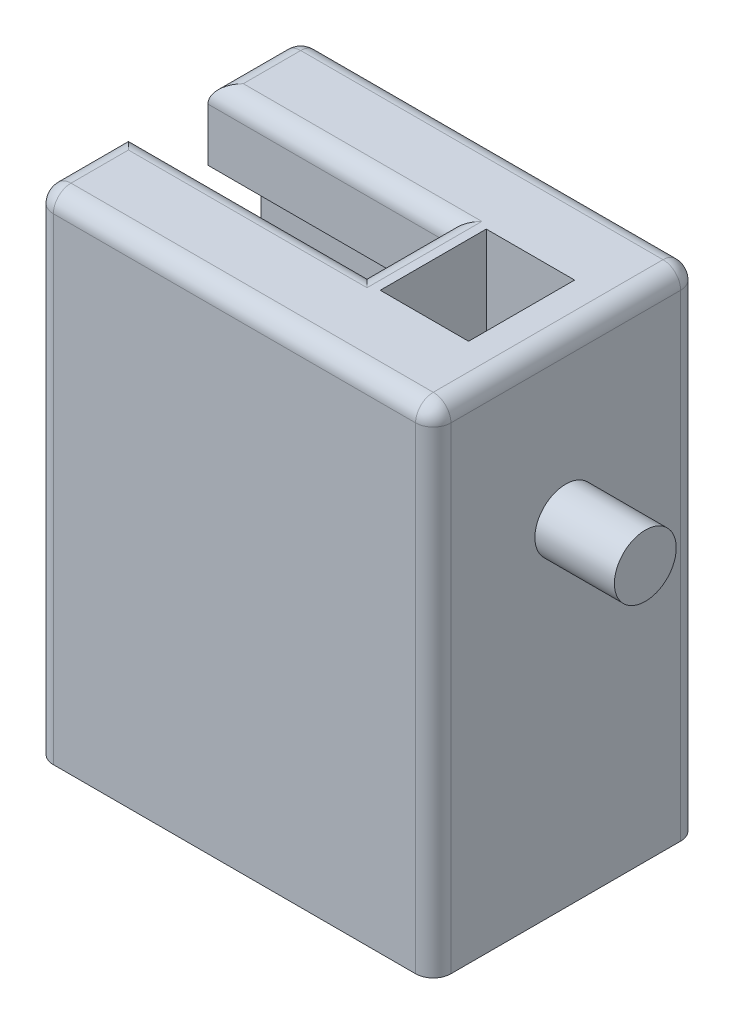
ISO-10303-21;
HEADER;
FILE_DESCRIPTION(('STEP AP214'),'2;1');
FILE_NAME('part.step','',(''),(''),'','','');
FILE_SCHEMA(('AUTOMOTIVE_DESIGN { 1 0 10303 214 1 1 1 1 }'));
ENDSEC;
DATA;
#1=APPLICATION_CONTEXT('core data for automotive mechanical design processes');
#2=APPLICATION_PROTOCOL_DEFINITION('international standard','automotive_design',2000,#1);
#3=PRODUCT_CONTEXT('',#1,'mechanical');
#4=PRODUCT('Part','Part','',(#3));
#5=PRODUCT_RELATED_PRODUCT_CATEGORY('part','',(#4));
#6=PRODUCT_DEFINITION_FORMATION('','',#4);
#7=PRODUCT_DEFINITION_CONTEXT('part definition',#1,'design');
#8=PRODUCT_DEFINITION('design','',#6,#7);
#9=PRODUCT_DEFINITION_SHAPE('','',#8);
#10=(LENGTH_UNIT() NAMED_UNIT(*) SI_UNIT(.MILLI.,.METRE.));
#11=(NAMED_UNIT(*) PLANE_ANGLE_UNIT() SI_UNIT($,.RADIAN.));
#12=(NAMED_UNIT(*) SI_UNIT($,.STERADIAN.) SOLID_ANGLE_UNIT());
#13=UNCERTAINTY_MEASURE_WITH_UNIT(LENGTH_MEASURE(1.E-05),#10,'distance_accuracy_value','');
#14=(GEOMETRIC_REPRESENTATION_CONTEXT(3) GLOBAL_UNCERTAINTY_ASSIGNED_CONTEXT((#13)) GLOBAL_UNIT_ASSIGNED_CONTEXT((#10,
#11,#12)) REPRESENTATION_CONTEXT('',''));
#15=CARTESIAN_POINT('',(0.,0.,0.));
#16=DIRECTION('',(0.,0.,1.));
#17=DIRECTION('',(1.,0.,0.));
#18=AXIS2_PLACEMENT_3D('',#15,#16,#17);
#19=CARTESIAN_POINT('',(28.5,8.,15.));
#20=DIRECTION('',(-1.,0.,0.));
#21=DIRECTION('',(0.,0.,1.));
#22=AXIS2_PLACEMENT_3D('',#19,#20,#21);
#23=PLANE('',#22);
#24=CARTESIAN_POINT('',(28.5,38.,0.));
#25=DIRECTION('',(-1.,0.,0.));
#26=DIRECTION('',(0.,0.,1.));
#27=AXIS2_PLACEMENT_3D('',#24,#25,#26);
#28=CIRCLE('',#27,3.5);
#29=CARTESIAN_POINT('',(28.5,38.,3.5));
#30=VERTEX_POINT('',#29);
#31=EDGE_CURVE('E13',#30,#30,#28,.F.);
#32=ORIENTED_EDGE('',*,*,#31,.F.);
#33=EDGE_LOOP('',(#32));
#34=FACE_BOUND('',#33,.T.);
#35=DIRECTION('',(0.,0.,-1.));
#36=VECTOR('',#35,1.);
#37=CARTESIAN_POINT('',(28.5,0.,15.));
#38=LINE('',#37,#36);
#39=CARTESIAN_POINT('',(28.5,0.,13.));
#40=VERTEX_POINT('',#39);
#41=CARTESIAN_POINT('',(28.5,0.,-13.));
#42=VERTEX_POINT('',#41);
#43=EDGE_CURVE('E322',#40,#42,#38,.T.);
#44=ORIENTED_EDGE('',*,*,#43,.T.);
#45=DIRECTION('',(0.,-1.,0.));
#46=VECTOR('',#45,1.);
#47=CARTESIAN_POINT('',(28.5,8.,-13.));
#48=LINE('',#47,#46);
#49=CARTESIAN_POINT('',(28.5,54.,-13.));
#50=VERTEX_POINT('',#49);
#51=EDGE_CURVE('E380',#42,#50,#48,.F.);
#52=ORIENTED_EDGE('',*,*,#51,.T.);
#53=DIRECTION('',(0.,0.,1.));
#54=VECTOR('',#53,1.);
#55=CARTESIAN_POINT('',(28.5,54.,15.));
#56=LINE('',#55,#54);
#57=CARTESIAN_POINT('',(28.5,54.,13.));
#58=VERTEX_POINT('',#57);
#59=EDGE_CURVE('E378',#50,#58,#56,.T.);
#60=ORIENTED_EDGE('',*,*,#59,.T.);
#61=DIRECTION('',(0.,-1.,0.));
#62=VECTOR('',#61,1.);
#63=CARTESIAN_POINT('',(28.5,8.,13.));
#64=LINE('',#63,#62);
#65=EDGE_CURVE('E376',#58,#40,#64,.T.);
#66=ORIENTED_EDGE('',*,*,#65,.T.);
#67=EDGE_LOOP('',(#44,#52,#60,#66));
#68=FACE_BOUND('',#67,.T.);
#69=ADVANCED_FACE('F47',(#34,#68),#23,.F.);
#70=CARTESIAN_POINT('',(-16.5,8.,-15.));
#71=DIRECTION('',(0.,0.,1.));
#72=DIRECTION('',(1.,0.,0.));
#73=AXIS2_PLACEMENT_3D('',#70,#71,#72);
#74=PLANE('',#73);
#75=DIRECTION('',(-1.,0.,0.));
#76=VECTOR('',#75,1.);
#77=CARTESIAN_POINT('',(28.5,54.,-15.));
#78=LINE('',#77,#76);
#79=CARTESIAN_POINT('',(-14.5,54.,-15.));
#80=VERTEX_POINT('',#79);
#81=CARTESIAN_POINT('',(26.5,54.,-15.));
#82=VERTEX_POINT('',#81);
#83=EDGE_CURVE('E372',#80,#82,#78,.F.);
#84=ORIENTED_EDGE('',*,*,#83,.T.);
#85=DIRECTION('',(0.,-1.,0.));
#86=VECTOR('',#85,1.);
#87=CARTESIAN_POINT('',(26.5,8.,-15.));
#88=LINE('',#87,#86);
#89=CARTESIAN_POINT('',(26.5,0.,-15.));
#90=VERTEX_POINT('',#89);
#91=EDGE_CURVE('E374',#82,#90,#88,.T.);
#92=ORIENTED_EDGE('',*,*,#91,.T.);
#93=DIRECTION('',(-1.,0.,0.));
#94=VECTOR('',#93,1.);
#95=CARTESIAN_POINT('',(-16.5,0.,-15.));
#96=LINE('',#95,#94);
#97=CARTESIAN_POINT('',(-14.5,0.,-15.));
#98=VERTEX_POINT('',#97);
#99=EDGE_CURVE('E335',#90,#98,#96,.T.);
#100=ORIENTED_EDGE('',*,*,#99,.T.);
#101=DIRECTION('',(0.,-1.,0.));
#102=VECTOR('',#101,1.);
#103=CARTESIAN_POINT('',(-14.5,8.,-15.));
#104=LINE('',#103,#102);
#105=EDGE_CURVE('E370',#98,#80,#104,.F.);
#106=ORIENTED_EDGE('',*,*,#105,.T.);
#107=EDGE_LOOP('',(#84,#92,#100,#106));
#108=FACE_BOUND('',#107,.T.);
#109=ADVANCED_FACE('F513',(#108),#74,.F.);
#110=CARTESIAN_POINT('',(-16.5,8.,15.));
#111=DIRECTION('',(1.,0.,0.));
#112=DIRECTION('',(0.,0.,-1.));
#113=AXIS2_PLACEMENT_3D('',#110,#111,#112);
#114=PLANE('',#113);
#115=CARTESIAN_POINT('',(-16.5,3.5,-5.));
#116=DIRECTION('',(-1.,0.,0.));
#117=DIRECTION('',(0.,0.,1.));
#118=AXIS2_PLACEMENT_3D('',#115,#116,#117);
#119=CIRCLE('',#118,1.59999999999999);
#120=CARTESIAN_POINT('',(-16.5,3.5,-3.40000000000001));
#121=VERTEX_POINT('',#120);
#122=EDGE_CURVE('E247',#121,#121,#119,.T.);
#123=ORIENTED_EDGE('',*,*,#122,.F.);
#124=EDGE_LOOP('',(#123));
#125=FACE_BOUND('',#124,.T.);
#126=CARTESIAN_POINT('',(-16.5,3.5,5.));
#127=DIRECTION('',(-1.,0.,0.));
#128=DIRECTION('',(0.,0.,1.));
#129=AXIS2_PLACEMENT_3D('',#126,#127,#128);
#130=CIRCLE('',#129,1.59999999999999);
#131=CARTESIAN_POINT('',(-16.5,3.5,6.59999999999999));
#132=VERTEX_POINT('',#131);
#133=EDGE_CURVE('E256',#132,#132,#130,.T.);
#134=ORIENTED_EDGE('',*,*,#133,.F.);
#135=EDGE_LOOP('',(#134));
#136=FACE_BOUND('',#135,.T.);
#137=DIRECTION('',(0.,-1.,0.));
#138=VECTOR('',#137,1.);
#139=CARTESIAN_POINT('',(-16.5,8.,13.));
#140=LINE('',#139,#138);
#141=CARTESIAN_POINT('',(-16.5,0.,13.));
#142=VERTEX_POINT('',#141);
#143=CARTESIAN_POINT('',(-16.5,54.,13.));
#144=VERTEX_POINT('',#143);
#145=EDGE_CURVE('E349',#142,#144,#140,.F.);
#146=ORIENTED_EDGE('',*,*,#145,.T.);
#147=DIRECTION('',(0.,0.,-1.));
#148=VECTOR('',#147,1.);
#149=CARTESIAN_POINT('',(-16.5,54.,4.5));
#150=LINE('',#149,#148);
#151=CARTESIAN_POINT('',(-16.5,54.,4.5));
#152=VERTEX_POINT('',#151);
#153=EDGE_CURVE('E351',#144,#152,#150,.T.);
#154=ORIENTED_EDGE('',*,*,#153,.T.);
#155=DIRECTION('',(0.,1.,0.));
#156=VECTOR('',#155,1.);
#157=CARTESIAN_POINT('',(-16.5,48.,4.50000000000001));
#158=LINE('',#157,#156);
#159=CARTESIAN_POINT('',(-16.5,48.,4.50000000000001));
#160=VERTEX_POINT('',#159);
#161=EDGE_CURVE('E307',#160,#152,#158,.T.);
#162=ORIENTED_EDGE('',*,*,#161,.F.);
#163=DIRECTION('',(0.,0.,-1.));
#164=VECTOR('',#163,1.);
#165=CARTESIAN_POINT('',(-16.5,48.,10.5));
#166=LINE('',#165,#164);
#167=CARTESIAN_POINT('',(-16.5,48.,10.5));
#168=VERTEX_POINT('',#167);
#169=EDGE_CURVE('E303',#168,#160,#166,.T.);
#170=ORIENTED_EDGE('',*,*,#169,.F.);
#171=DIRECTION('',(0.,1.,0.));
#172=VECTOR('',#171,1.);
#173=CARTESIAN_POINT('',(-16.5,8.,10.5));
#174=LINE('',#173,#172);
#175=CARTESIAN_POINT('',(-16.5,8.,10.5));
#176=VERTEX_POINT('',#175);
#177=EDGE_CURVE('E300',#176,#168,#174,.T.);
#178=ORIENTED_EDGE('',*,*,#177,.F.);
#179=DIRECTION('',(0.,0.,1.));
#180=VECTOR('',#179,1.);
#181=CARTESIAN_POINT('',(-16.5,8.,-10.5));
#182=LINE('',#181,#180);
#183=CARTESIAN_POINT('',(-16.5,8.,-10.5));
#184=VERTEX_POINT('',#183);
#185=EDGE_CURVE('E282',#184,#176,#182,.T.);
#186=ORIENTED_EDGE('',*,*,#185,.F.);
#187=DIRECTION('',(0.,-1.,0.));
#188=VECTOR('',#187,1.);
#189=CARTESIAN_POINT('',(-16.5,48.,-10.5));
#190=LINE('',#189,#188);
#191=CARTESIAN_POINT('',(-16.5,48.,-10.5));
#192=VERTEX_POINT('',#191);
#193=EDGE_CURVE('E315',#192,#184,#190,.T.);
#194=ORIENTED_EDGE('',*,*,#193,.F.);
#195=DIRECTION('',(0.,0.,-1.));
#196=VECTOR('',#195,1.);
#197=CARTESIAN_POINT('',(-16.5,48.,-4.49999999999999));
#198=LINE('',#197,#196);
#199=CARTESIAN_POINT('',(-16.5,48.,-4.49999999999999));
#200=VERTEX_POINT('',#199);
#201=EDGE_CURVE('E312',#200,#192,#198,.T.);
#202=ORIENTED_EDGE('',*,*,#201,.F.);
#203=DIRECTION('',(0.,-1.,0.));
#204=VECTOR('',#203,1.);
#205=CARTESIAN_POINT('',(-16.5,56.,-4.5));
#206=LINE('',#205,#204);
#207=CARTESIAN_POINT('',(-16.5,54.,-4.5));
#208=VERTEX_POINT('',#207);
#209=EDGE_CURVE('E310',#208,#200,#206,.T.);
#210=ORIENTED_EDGE('',*,*,#209,.F.);
#211=DIRECTION('',(0.,0.,-1.));
#212=VECTOR('',#211,1.);
#213=CARTESIAN_POINT('',(-16.5,54.,-15.));
#214=LINE('',#213,#212);
#215=CARTESIAN_POINT('',(-16.5,54.,-13.));
#216=VERTEX_POINT('',#215);
#217=EDGE_CURVE('E346',#208,#216,#214,.T.);
#218=ORIENTED_EDGE('',*,*,#217,.T.);
#219=DIRECTION('',(0.,-1.,0.));
#220=VECTOR('',#219,1.);
#221=CARTESIAN_POINT('',(-16.5,8.,-13.));
#222=LINE('',#221,#220);
#223=CARTESIAN_POINT('',(-16.5,0.,-13.));
#224=VERTEX_POINT('',#223);
#225=EDGE_CURVE('E344',#216,#224,#222,.T.);
#226=ORIENTED_EDGE('',*,*,#225,.T.);
#227=DIRECTION('',(0.,0.,1.));
#228=VECTOR('',#227,1.);
#229=CARTESIAN_POINT('',(-16.5,0.,15.));
#230=LINE('',#229,#228);
#231=EDGE_CURVE('E338',#224,#142,#230,.T.);
#232=ORIENTED_EDGE('',*,*,#231,.T.);
#233=EDGE_LOOP('',(#146,#154,#162,#170,#178,#186,#194,#202,#210,#218,#226,#232));
#234=FACE_BOUND('',#233,.T.);
#235=ADVANCED_FACE('F459',(#125,#136,#234),#114,.F.);
#236=CARTESIAN_POINT('',(-16.5,8.,15.));
#237=DIRECTION('',(0.,0.,-1.));
#238=DIRECTION('',(-1.,0.,0.));
#239=AXIS2_PLACEMENT_3D('',#236,#237,#238);
#240=PLANE('',#239);
#241=DIRECTION('',(1.,0.,0.));
#242=VECTOR('',#241,1.);
#243=CARTESIAN_POINT('',(-16.5,0.,15.));
#244=LINE('',#243,#242);
#245=CARTESIAN_POINT('',(-14.5,0.,15.));
#246=VERTEX_POINT('',#245);
#247=CARTESIAN_POINT('',(26.5,0.,15.));
#248=VERTEX_POINT('',#247);
#249=EDGE_CURVE('E341',#246,#248,#244,.T.);
#250=ORIENTED_EDGE('',*,*,#249,.T.);
#251=DIRECTION('',(0.,-1.,0.));
#252=VECTOR('',#251,1.);
#253=CARTESIAN_POINT('',(26.5,8.,15.));
#254=LINE('',#253,#252);
#255=CARTESIAN_POINT('',(26.5,54.,15.));
#256=VERTEX_POINT('',#255);
#257=EDGE_CURVE('E386',#248,#256,#254,.F.);
#258=ORIENTED_EDGE('',*,*,#257,.T.);
#259=DIRECTION('',(-1.,0.,0.));
#260=VECTOR('',#259,1.);
#261=CARTESIAN_POINT('',(-16.5,54.,15.));
#262=LINE('',#261,#260);
#263=CARTESIAN_POINT('',(-14.5,54.,15.));
#264=VERTEX_POINT('',#263);
#265=EDGE_CURVE('E384',#256,#264,#262,.T.);
#266=ORIENTED_EDGE('',*,*,#265,.T.);
#267=DIRECTION('',(0.,-1.,0.));
#268=VECTOR('',#267,1.);
#269=CARTESIAN_POINT('',(-14.5,8.,15.));
#270=LINE('',#269,#268);
#271=EDGE_CURVE('E382',#264,#246,#270,.T.);
#272=ORIENTED_EDGE('',*,*,#271,.T.);
#273=EDGE_LOOP('',(#250,#258,#266,#272));
#274=FACE_BOUND('',#273,.T.);
#275=ADVANCED_FACE('F549',(#274),#240,.F.);
#276=CARTESIAN_POINT('',(0.,0.,0.));
#277=DIRECTION('',(0.,-1.,0.));
#278=DIRECTION('',(0.,0.,-1.));
#279=AXIS2_PLACEMENT_3D('',#276,#277,#278);
#280=PLANE('',#279);
#281=DIRECTION('',(0.,0.,1.));
#282=VECTOR('',#281,1.);
#283=CARTESIAN_POINT('',(13.5,0.,-6.));
#284=LINE('',#283,#282);
#285=CARTESIAN_POINT('',(13.5,0.,-6.));
#286=VERTEX_POINT('',#285);
#287=CARTESIAN_POINT('',(13.5,0.,6.));
#288=VERTEX_POINT('',#287);
#289=EDGE_CURVE('E216',#286,#288,#284,.T.);
#290=ORIENTED_EDGE('',*,*,#289,.T.);
#291=DIRECTION('',(1.,0.,0.));
#292=VECTOR('',#291,1.);
#293=CARTESIAN_POINT('',(23.5,0.,6.));
#294=LINE('',#293,#292);
#295=CARTESIAN_POINT('',(23.5,0.,6.));
#296=VERTEX_POINT('',#295);
#297=EDGE_CURVE('E225',#288,#296,#294,.T.);
#298=ORIENTED_EDGE('',*,*,#297,.T.);
#299=DIRECTION('',(0.,0.,-1.));
#300=VECTOR('',#299,1.);
#301=CARTESIAN_POINT('',(23.5,0.,-6.));
#302=LINE('',#301,#300);
#303=CARTESIAN_POINT('',(23.5,0.,-6.));
#304=VERTEX_POINT('',#303);
#305=EDGE_CURVE('E62',#296,#304,#302,.T.);
#306=ORIENTED_EDGE('',*,*,#305,.T.);
#307=DIRECTION('',(-1.,0.,0.));
#308=VECTOR('',#307,1.);
#309=CARTESIAN_POINT('',(23.5,0.,-6.));
#310=LINE('',#309,#308);
#311=EDGE_CURVE('E222',#304,#286,#310,.T.);
#312=ORIENTED_EDGE('',*,*,#311,.T.);
#313=EDGE_LOOP('',(#290,#298,#306,#312));
#314=FACE_BOUND('',#313,.T.);
#315=CARTESIAN_POINT('',(-7.5,0.,0.));
#316=DIRECTION('',(0.,1.,0.));
#317=DIRECTION('',(0.,0.,1.));
#318=AXIS2_PLACEMENT_3D('',#315,#316,#317);
#319=CIRCLE('',#318,1.6);
#320=CARTESIAN_POINT('',(-7.5,0.,1.6));
#321=VERTEX_POINT('',#320);
#322=EDGE_CURVE('E265',#321,#321,#319,.T.);
#323=ORIENTED_EDGE('',*,*,#322,.T.);
#324=EDGE_LOOP('',(#323));
#325=FACE_BOUND('',#324,.T.);
#326=CARTESIAN_POINT('',(7.5,0.,0.));
#327=DIRECTION('',(0.,1.,0.));
#328=DIRECTION('',(0.,0.,1.));
#329=AXIS2_PLACEMENT_3D('',#326,#327,#328);
#330=CIRCLE('',#329,1.6);
#331=CARTESIAN_POINT('',(7.5,0.,1.6));
#332=VERTEX_POINT('',#331);
#333=EDGE_CURVE('E271',#332,#332,#330,.T.);
#334=ORIENTED_EDGE('',*,*,#333,.T.);
#335=EDGE_LOOP('',(#334));
#336=FACE_BOUND('',#335,.T.);
#337=ORIENTED_EDGE('',*,*,#99,.F.);
#338=CARTESIAN_POINT('',(26.5,0.,-13.));
#339=DIRECTION('',(0.,-1.,0.));
#340=DIRECTION('',(0.,0.,-1.));
#341=AXIS2_PLACEMENT_3D('',#338,#339,#340);
#342=CIRCLE('',#341,2.);
#343=EDGE_CURVE('E55',#90,#42,#342,.T.);
#344=ORIENTED_EDGE('',*,*,#343,.T.);
#345=ORIENTED_EDGE('',*,*,#43,.F.);
#346=CARTESIAN_POINT('',(26.5,0.,13.));
#347=DIRECTION('',(0.,-1.,0.));
#348=DIRECTION('',(0.,0.,-1.));
#349=AXIS2_PLACEMENT_3D('',#346,#347,#348);
#350=CIRCLE('',#349,2.);
#351=EDGE_CURVE('E398',#40,#248,#350,.T.);
#352=ORIENTED_EDGE('',*,*,#351,.T.);
#353=ORIENTED_EDGE('',*,*,#249,.F.);
#354=CARTESIAN_POINT('',(-14.5,0.,13.));
#355=DIRECTION('',(0.,-1.,0.));
#356=DIRECTION('',(0.,0.,-1.));
#357=AXIS2_PLACEMENT_3D('',#354,#355,#356);
#358=CIRCLE('',#357,2.);
#359=EDGE_CURVE('E396',#246,#142,#358,.T.);
#360=ORIENTED_EDGE('',*,*,#359,.T.);
#361=ORIENTED_EDGE('',*,*,#231,.F.);
#362=CARTESIAN_POINT('',(-14.5,0.,-13.));
#363=DIRECTION('',(0.,-1.,0.));
#364=DIRECTION('',(0.,0.,-1.));
#365=AXIS2_PLACEMENT_3D('',#362,#363,#364);
#366=CIRCLE('',#365,2.);
#367=EDGE_CURVE('E394',#224,#98,#366,.T.);
#368=ORIENTED_EDGE('',*,*,#367,.T.);
#369=EDGE_LOOP('',(#337,#344,#345,#352,#353,#360,#361,#368));
#370=FACE_BOUND('',#369,.T.);
#371=ADVANCED_FACE('F229',(#314,#325,#336,#370),#280,.T.);
#372=CARTESIAN_POINT('',(85.1038867923396,56.,-15.));
#373=DIRECTION('',(0.,1.,0.));
#374=DIRECTION('',(0.,0.,1.));
#375=AXIS2_PLACEMENT_3D('',#372,#373,#374);
#376=PLANE('',#375);
#377=DIRECTION('',(0.,0.,1.));
#378=VECTOR('',#377,1.);
#379=CARTESIAN_POINT('',(13.5,56.,-6.));
#380=LINE('',#379,#378);
#381=CARTESIAN_POINT('',(13.5,56.,-6.));
#382=VERTEX_POINT('',#381);
#383=CARTESIAN_POINT('',(13.5,56.,6.));
#384=VERTEX_POINT('',#383);
#385=EDGE_CURVE('E70',#382,#384,#380,.T.);
#386=ORIENTED_EDGE('',*,*,#385,.F.);
#387=DIRECTION('',(-1.,0.,0.));
#388=VECTOR('',#387,1.);
#389=CARTESIAN_POINT('',(23.5,56.,-6.));
#390=LINE('',#389,#388);
#391=CARTESIAN_POINT('',(23.5,56.,-6.));
#392=VERTEX_POINT('',#391);
#393=EDGE_CURVE('E232',#392,#382,#390,.T.);
#394=ORIENTED_EDGE('',*,*,#393,.F.);
#395=DIRECTION('',(0.,0.,-1.));
#396=VECTOR('',#395,1.);
#397=CARTESIAN_POINT('',(23.5,56.,-6.));
#398=LINE('',#397,#396);
#399=CARTESIAN_POINT('',(23.5,56.,6.));
#400=VERTEX_POINT('',#399);
#401=EDGE_CURVE('E235',#400,#392,#398,.T.);
#402=ORIENTED_EDGE('',*,*,#401,.F.);
#403=DIRECTION('',(1.,0.,0.));
#404=VECTOR('',#403,1.);
#405=CARTESIAN_POINT('',(23.5,56.,6.));
#406=LINE('',#405,#404);
#407=EDGE_CURVE('E241',#384,#400,#406,.T.);
#408=ORIENTED_EDGE('',*,*,#407,.F.);
#409=EDGE_LOOP('',(#386,#394,#402,#408));
#410=FACE_BOUND('',#409,.T.);
#411=DIRECTION('',(-1.,0.,0.));
#412=VECTOR('',#411,1.);
#413=CARTESIAN_POINT('',(-16.5,56.,-13.));
#414=LINE('',#413,#412);
#415=CARTESIAN_POINT('',(26.5,56.,-13.));
#416=VERTEX_POINT('',#415);
#417=CARTESIAN_POINT('',(-14.5,56.,-13.));
#418=VERTEX_POINT('',#417);
#419=EDGE_CURVE('E365',#416,#418,#414,.T.);
#420=ORIENTED_EDGE('',*,*,#419,.T.);
#421=DIRECTION('',(0.,0.,-1.));
#422=VECTOR('',#421,1.);
#423=CARTESIAN_POINT('',(-14.5,56.,-4.5));
#424=LINE('',#423,#422);
#425=CARTESIAN_POINT('',(-14.5,56.,-6.5));
#426=VERTEX_POINT('',#425);
#427=EDGE_CURVE('E367',#418,#426,#424,.F.);
#428=ORIENTED_EDGE('',*,*,#427,.T.);
#429=DIRECTION('',(-1.,0.,0.));
#430=VECTOR('',#429,1.);
#431=CARTESIAN_POINT('',(10.5,56.,-6.5));
#432=LINE('',#431,#430);
#433=CARTESIAN_POINT('',(12.5,56.,-6.5));
#434=VERTEX_POINT('',#433);
#435=EDGE_CURVE('E353',#426,#434,#432,.F.);
#436=ORIENTED_EDGE('',*,*,#435,.T.);
#437=DIRECTION('',(0.,0.,-1.));
#438=VECTOR('',#437,1.);
#439=CARTESIAN_POINT('',(12.5,56.,-15.));
#440=LINE('',#439,#438);
#441=CARTESIAN_POINT('',(12.5,56.,6.5));
#442=VERTEX_POINT('',#441);
#443=EDGE_CURVE('E355',#434,#442,#440,.F.);
#444=ORIENTED_EDGE('',*,*,#443,.T.);
#445=DIRECTION('',(-1.,0.,0.));
#446=VECTOR('',#445,1.);
#447=CARTESIAN_POINT('',(-16.5,56.,6.5));
#448=LINE('',#447,#446);
#449=CARTESIAN_POINT('',(-14.5,56.,6.5));
#450=VERTEX_POINT('',#449);
#451=EDGE_CURVE('E357',#442,#450,#448,.T.);
#452=ORIENTED_EDGE('',*,*,#451,.T.);
#453=DIRECTION('',(0.,0.,-1.));
#454=VECTOR('',#453,1.);
#455=CARTESIAN_POINT('',(-14.5,56.,15.));
#456=LINE('',#455,#454);
#457=CARTESIAN_POINT('',(-14.5,56.,13.));
#458=VERTEX_POINT('',#457);
#459=EDGE_CURVE('E359',#450,#458,#456,.F.);
#460=ORIENTED_EDGE('',*,*,#459,.T.);
#461=DIRECTION('',(-1.,0.,0.));
#462=VECTOR('',#461,1.);
#463=CARTESIAN_POINT('',(28.5,56.,13.));
#464=LINE('',#463,#462);
#465=CARTESIAN_POINT('',(26.5,56.,13.));
#466=VERTEX_POINT('',#465);
#467=EDGE_CURVE('E361',#458,#466,#464,.F.);
#468=ORIENTED_EDGE('',*,*,#467,.T.);
#469=DIRECTION('',(0.,0.,1.));
#470=VECTOR('',#469,1.);
#471=CARTESIAN_POINT('',(26.5,56.,-15.));
#472=LINE('',#471,#470);
#473=EDGE_CURVE('E363',#466,#416,#472,.F.);
#474=ORIENTED_EDGE('',*,*,#473,.T.);
#475=EDGE_LOOP('',(#420,#428,#436,#444,#452,#460,#468,#474));
#476=FACE_BOUND('',#475,.T.);
#477=ADVANCED_FACE('F545',(#410,#476),#376,.T.);
#478=CARTESIAN_POINT('',(10.5,8.,10.5));
#479=DIRECTION('',(0.,0.,1.));
#480=DIRECTION('',(0.,-1.,0.));
#481=AXIS2_PLACEMENT_3D('',#478,#479,#480);
#482=PLANE('',#481);
#483=ORIENTED_EDGE('',*,*,#177,.T.);
#484=DIRECTION('',(-1.,0.,0.));
#485=VECTOR('',#484,1.);
#486=CARTESIAN_POINT('',(10.5,48.,10.5));
#487=LINE('',#486,#485);
#488=CARTESIAN_POINT('',(10.5,48.,10.5));
#489=VERTEX_POINT('',#488);
#490=EDGE_CURVE('E299',#489,#168,#487,.T.);
#491=ORIENTED_EDGE('',*,*,#490,.F.);
#492=DIRECTION('',(0.,1.,0.));
#493=VECTOR('',#492,1.);
#494=CARTESIAN_POINT('',(10.5,8.,10.5));
#495=LINE('',#494,#493);
#496=CARTESIAN_POINT('',(10.5,8.,10.5));
#497=VERTEX_POINT('',#496);
#498=EDGE_CURVE('E278',#497,#489,#495,.T.);
#499=ORIENTED_EDGE('',*,*,#498,.F.);
#500=DIRECTION('',(-1.,0.,0.));
#501=VECTOR('',#500,1.);
#502=CARTESIAN_POINT('',(10.5,8.,10.5));
#503=LINE('',#502,#501);
#504=EDGE_CURVE('E320',#497,#176,#503,.T.);
#505=ORIENTED_EDGE('',*,*,#504,.T.);
#506=EDGE_LOOP('',(#483,#491,#499,#505));
#507=FACE_BOUND('',#506,.T.);
#508=ADVANCED_FACE('F472',(#507),#482,.F.);
#509=CARTESIAN_POINT('',(10.5,8.,-10.5));
#510=DIRECTION('',(0.,-1.,0.));
#511=DIRECTION('',(0.,0.,-1.));
#512=AXIS2_PLACEMENT_3D('',#509,#510,#511);
#513=PLANE('',#512);
#514=CARTESIAN_POINT('',(-7.5,8.,0.));
#515=DIRECTION('',(0.,1.,0.));
#516=DIRECTION('',(0.,0.,1.));
#517=AXIS2_PLACEMENT_3D('',#514,#515,#516);
#518=CIRCLE('',#517,1.6);
#519=CARTESIAN_POINT('',(-7.5,8.,1.6));
#520=VERTEX_POINT('',#519);
#521=EDGE_CURVE('E262',#520,#520,#518,.T.);
#522=ORIENTED_EDGE('',*,*,#521,.F.);
#523=EDGE_LOOP('',(#522));
#524=FACE_BOUND('',#523,.T.);
#525=CARTESIAN_POINT('',(7.5,8.,0.));
#526=DIRECTION('',(0.,1.,0.));
#527=DIRECTION('',(0.,0.,1.));
#528=AXIS2_PLACEMENT_3D('',#525,#526,#527);
#529=CIRCLE('',#528,1.6);
#530=CARTESIAN_POINT('',(7.5,8.,1.6));
#531=VERTEX_POINT('',#530);
#532=EDGE_CURVE('E268',#531,#531,#529,.T.);
#533=ORIENTED_EDGE('',*,*,#532,.F.);
#534=EDGE_LOOP('',(#533));
#535=FACE_BOUND('',#534,.T.);
#536=ORIENTED_EDGE('',*,*,#185,.T.);
#537=ORIENTED_EDGE('',*,*,#504,.F.);
#538=DIRECTION('',(0.,0.,1.));
#539=VECTOR('',#538,1.);
#540=CARTESIAN_POINT('',(10.5,8.,-10.5));
#541=LINE('',#540,#539);
#542=CARTESIAN_POINT('',(10.5,8.,-10.5));
#543=VERTEX_POINT('',#542);
#544=EDGE_CURVE('E296',#543,#497,#541,.T.);
#545=ORIENTED_EDGE('',*,*,#544,.F.);
#546=DIRECTION('',(-1.,0.,0.));
#547=VECTOR('',#546,1.);
#548=CARTESIAN_POINT('',(10.5,8.,-10.5));
#549=LINE('',#548,#547);
#550=EDGE_CURVE('E323',#543,#184,#549,.T.);
#551=ORIENTED_EDGE('',*,*,#550,.T.);
#552=EDGE_LOOP('',(#536,#537,#545,#551));
#553=FACE_BOUND('',#552,.T.);
#554=ADVANCED_FACE('F476',(#524,#535,#553),#513,.F.);
#555=CARTESIAN_POINT('',(10.5,48.,-10.5));
#556=DIRECTION('',(0.,0.,-1.));
#557=DIRECTION('',(0.,1.,0.));
#558=AXIS2_PLACEMENT_3D('',#555,#556,#557);
#559=PLANE('',#558);
#560=ORIENTED_EDGE('',*,*,#193,.T.);
#561=ORIENTED_EDGE('',*,*,#550,.F.);
#562=DIRECTION('',(0.,-1.,0.));
#563=VECTOR('',#562,1.);
#564=CARTESIAN_POINT('',(10.5,48.,-10.5));
#565=LINE('',#564,#563);
#566=CARTESIAN_POINT('',(10.5,48.,-10.5));
#567=VERTEX_POINT('',#566);
#568=EDGE_CURVE('E293',#567,#543,#565,.T.);
#569=ORIENTED_EDGE('',*,*,#568,.F.);
#570=DIRECTION('',(-1.,0.,0.));
#571=VECTOR('',#570,1.);
#572=CARTESIAN_POINT('',(10.5,48.,-10.5));
#573=LINE('',#572,#571);
#574=EDGE_CURVE('E325',#567,#192,#573,.T.);
#575=ORIENTED_EDGE('',*,*,#574,.T.);
#576=EDGE_LOOP('',(#560,#561,#569,#575));
#577=FACE_BOUND('',#576,.T.);
#578=ADVANCED_FACE('F479',(#577),#559,.F.);
#579=CARTESIAN_POINT('',(10.5,48.,-4.49999999999999));
#580=DIRECTION('',(0.,1.,0.));
#581=DIRECTION('',(0.,0.,1.));
#582=AXIS2_PLACEMENT_3D('',#579,#580,#581);
#583=PLANE('',#582);
#584=ORIENTED_EDGE('',*,*,#201,.T.);
#585=ORIENTED_EDGE('',*,*,#574,.F.);
#586=DIRECTION('',(0.,0.,-1.));
#587=VECTOR('',#586,1.);
#588=CARTESIAN_POINT('',(10.5,48.,-4.49999999999999));
#589=LINE('',#588,#587);
#590=CARTESIAN_POINT('',(10.5,48.,-4.49999999999999));
#591=VERTEX_POINT('',#590);
#592=EDGE_CURVE('E290',#591,#567,#589,.T.);
#593=ORIENTED_EDGE('',*,*,#592,.F.);
#594=DIRECTION('',(-1.,0.,0.));
#595=VECTOR('',#594,1.);
#596=CARTESIAN_POINT('',(10.5,48.,-4.49999999999999));
#597=LINE('',#596,#595);
#598=EDGE_CURVE('E327',#591,#200,#597,.T.);
#599=ORIENTED_EDGE('',*,*,#598,.T.);
#600=EDGE_LOOP('',(#584,#585,#593,#599));
#601=FACE_BOUND('',#600,.T.);
#602=ADVANCED_FACE('F484',(#601),#583,.F.);
#603=CARTESIAN_POINT('',(10.5,56.,-4.5));
#604=DIRECTION('',(0.,0.,-1.));
#605=DIRECTION('',(0.,1.,0.));
#606=AXIS2_PLACEMENT_3D('',#603,#604,#605);
#607=PLANE('',#606);
#608=DIRECTION('',(0.,-1.,0.));
#609=VECTOR('',#608,1.);
#610=CARTESIAN_POINT('',(10.5,56.,-4.5));
#611=LINE('',#610,#609);
#612=CARTESIAN_POINT('',(10.5,54.,-4.5));
#613=VERTEX_POINT('',#612);
#614=EDGE_CURVE('E288',#613,#591,#611,.T.);
#615=ORIENTED_EDGE('',*,*,#614,.F.);
#616=DIRECTION('',(-1.,0.,0.));
#617=VECTOR('',#616,1.);
#618=CARTESIAN_POINT('',(-16.5,54.,-4.5));
#619=LINE('',#618,#617);
#620=EDGE_CURVE('E392',#613,#208,#619,.T.);
#621=ORIENTED_EDGE('',*,*,#620,.T.);
#622=ORIENTED_EDGE('',*,*,#209,.T.);
#623=ORIENTED_EDGE('',*,*,#598,.F.);
#624=EDGE_LOOP('',(#615,#621,#622,#623));
#625=FACE_BOUND('',#624,.T.);
#626=ADVANCED_FACE('F489',(#625),#607,.F.);
#627=CARTESIAN_POINT('',(10.5,48.,4.50000000000001));
#628=DIRECTION('',(0.,0.,1.));
#629=DIRECTION('',(0.,-1.,0.));
#630=AXIS2_PLACEMENT_3D('',#627,#628,#629);
#631=PLANE('',#630);
#632=ORIENTED_EDGE('',*,*,#161,.T.);
#633=DIRECTION('',(-1.,0.,0.));
#634=VECTOR('',#633,1.);
#635=CARTESIAN_POINT('',(10.5,54.,4.5));
#636=LINE('',#635,#634);
#637=CARTESIAN_POINT('',(10.5,54.,4.5));
#638=VERTEX_POINT('',#637);
#639=EDGE_CURVE('E388',#152,#638,#636,.F.);
#640=ORIENTED_EDGE('',*,*,#639,.T.);
#641=DIRECTION('',(0.,1.,0.));
#642=VECTOR('',#641,1.);
#643=CARTESIAN_POINT('',(10.5,48.,4.50000000000001));
#644=LINE('',#643,#642);
#645=CARTESIAN_POINT('',(10.5,48.,4.50000000000001));
#646=VERTEX_POINT('',#645);
#647=EDGE_CURVE('E285',#646,#638,#644,.T.);
#648=ORIENTED_EDGE('',*,*,#647,.F.);
#649=DIRECTION('',(-1.,0.,0.));
#650=VECTOR('',#649,1.);
#651=CARTESIAN_POINT('',(10.5,48.,4.50000000000001));
#652=LINE('',#651,#650);
#653=EDGE_CURVE('E330',#646,#160,#652,.T.);
#654=ORIENTED_EDGE('',*,*,#653,.T.);
#655=EDGE_LOOP('',(#632,#640,#648,#654));
#656=FACE_BOUND('',#655,.T.);
#657=ADVANCED_FACE('F463',(#656),#631,.F.);
#658=CARTESIAN_POINT('',(10.5,48.,10.5));
#659=DIRECTION('',(0.,1.,0.));
#660=DIRECTION('',(0.,0.,1.));
#661=AXIS2_PLACEMENT_3D('',#658,#659,#660);
#662=PLANE('',#661);
#663=ORIENTED_EDGE('',*,*,#169,.T.);
#664=ORIENTED_EDGE('',*,*,#653,.F.);
#665=DIRECTION('',(0.,0.,-1.));
#666=VECTOR('',#665,1.);
#667=CARTESIAN_POINT('',(10.5,48.,10.5));
#668=LINE('',#667,#666);
#669=EDGE_CURVE('E281',#489,#646,#668,.T.);
#670=ORIENTED_EDGE('',*,*,#669,.F.);
#671=ORIENTED_EDGE('',*,*,#490,.T.);
#672=EDGE_LOOP('',(#663,#664,#670,#671));
#673=FACE_BOUND('',#672,.T.);
#674=ADVANCED_FACE('F467',(#673),#662,.F.);
#675=CARTESIAN_POINT('',(10.5,0.,0.));
#676=DIRECTION('',(-1.,0.,0.));
#677=DIRECTION('',(0.,0.,1.));
#678=AXIS2_PLACEMENT_3D('',#675,#676,#677);
#679=PLANE('',#678);
#680=ORIENTED_EDGE('',*,*,#647,.T.);
#681=DIRECTION('',(0.,0.,-1.));
#682=VECTOR('',#681,1.);
#683=CARTESIAN_POINT('',(10.5,54.,0.));
#684=LINE('',#683,#682);
#685=EDGE_CURVE('E390',#638,#613,#684,.T.);
#686=ORIENTED_EDGE('',*,*,#685,.T.);
#687=ORIENTED_EDGE('',*,*,#614,.T.);
#688=ORIENTED_EDGE('',*,*,#592,.T.);
#689=ORIENTED_EDGE('',*,*,#568,.T.);
#690=ORIENTED_EDGE('',*,*,#544,.T.);
#691=ORIENTED_EDGE('',*,*,#498,.T.);
#692=ORIENTED_EDGE('',*,*,#669,.T.);
#693=EDGE_LOOP('',(#680,#686,#687,#688,#689,#690,#691,#692));
#694=FACE_BOUND('',#693,.T.);
#695=ADVANCED_FACE('F552',(#694),#679,.T.);
#696=CARTESIAN_POINT('',(-14.5,8.,13.));
#697=DIRECTION('',(0.,-1.,0.));
#698=DIRECTION('',(0.,0.,-1.));
#699=AXIS2_PLACEMENT_3D('',#696,#697,#698);
#700=CYLINDRICAL_SURFACE('',#699,2.);
#701=ORIENTED_EDGE('',*,*,#359,.F.);
#702=ORIENTED_EDGE('',*,*,#271,.F.);
#703=CARTESIAN_POINT('',(-14.5,54.,13.));
#704=DIRECTION('',(0.,1.,0.));
#705=DIRECTION('',(0.,0.,1.));
#706=AXIS2_PLACEMENT_3D('',#703,#704,#705);
#707=CIRCLE('',#706,2.);
#708=EDGE_CURVE('E440',#144,#264,#707,.T.);
#709=ORIENTED_EDGE('',*,*,#708,.F.);
#710=ORIENTED_EDGE('',*,*,#145,.F.);
#711=EDGE_LOOP('',(#701,#702,#709,#710));
#712=FACE_BOUND('',#711,.T.);
#713=ADVANCED_FACE('F49',(#712),#700,.T.);
#714=CARTESIAN_POINT('',(26.5,8.,13.));
#715=DIRECTION('',(0.,-1.,0.));
#716=DIRECTION('',(0.,0.,-1.));
#717=AXIS2_PLACEMENT_3D('',#714,#715,#716);
#718=CYLINDRICAL_SURFACE('',#717,2.);
#719=ORIENTED_EDGE('',*,*,#351,.F.);
#720=ORIENTED_EDGE('',*,*,#65,.F.);
#721=CARTESIAN_POINT('',(26.5,54.,13.));
#722=DIRECTION('',(0.,1.,0.));
#723=DIRECTION('',(0.,0.,1.));
#724=AXIS2_PLACEMENT_3D('',#721,#722,#723);
#725=CIRCLE('',#724,2.);
#726=EDGE_CURVE('E437',#256,#58,#725,.T.);
#727=ORIENTED_EDGE('',*,*,#726,.F.);
#728=ORIENTED_EDGE('',*,*,#257,.F.);
#729=EDGE_LOOP('',(#719,#720,#727,#728));
#730=FACE_BOUND('',#729,.T.);
#731=ADVANCED_FACE('F535',(#730),#718,.T.);
#732=CARTESIAN_POINT('',(-16.5,54.,13.));
#733=DIRECTION('',(1.,0.,0.));
#734=DIRECTION('',(0.,0.,-1.));
#735=AXIS2_PLACEMENT_3D('',#732,#733,#734);
#736=CYLINDRICAL_SURFACE('',#735,2.);
#737=CARTESIAN_POINT('',(-14.5,54.,13.));
#738=DIRECTION('',(-1.,0.,0.));
#739=DIRECTION('',(0.,0.,1.));
#740=AXIS2_PLACEMENT_3D('',#737,#738,#739);
#741=CIRCLE('',#740,2.);
#742=EDGE_CURVE('E304',#264,#458,#741,.T.);
#743=ORIENTED_EDGE('',*,*,#742,.F.);
#744=ORIENTED_EDGE('',*,*,#265,.F.);
#745=CARTESIAN_POINT('',(26.5,54.,13.));
#746=DIRECTION('',(1.,0.,0.));
#747=DIRECTION('',(0.,0.,-1.));
#748=AXIS2_PLACEMENT_3D('',#745,#746,#747);
#749=CIRCLE('',#748,2.);
#750=EDGE_CURVE('E434',#466,#256,#749,.T.);
#751=ORIENTED_EDGE('',*,*,#750,.F.);
#752=ORIENTED_EDGE('',*,*,#467,.F.);
#753=EDGE_LOOP('',(#743,#744,#751,#752));
#754=FACE_BOUND('',#753,.T.);
#755=ADVANCED_FACE('F546',(#754),#736,.T.);
#756=CARTESIAN_POINT('',(-14.5,54.,13.));
#757=DIRECTION('',(0.,0.,1.));
#758=DIRECTION('',(1.,0.,0.));
#759=AXIS2_PLACEMENT_3D('',#756,#757,#758);
#760=SPHERICAL_SURFACE('',#759,2.);
#761=ORIENTED_EDGE('',*,*,#708,.T.);
#762=ORIENTED_EDGE('',*,*,#742,.T.);
#763=CARTESIAN_POINT('',(-14.5,54.,13.));
#764=DIRECTION('',(0.,0.,1.));
#765=DIRECTION('',(1.,0.,0.));
#766=AXIS2_PLACEMENT_3D('',#763,#764,#765);
#767=CIRCLE('',#766,2.);
#768=EDGE_CURVE('E431',#144,#458,#767,.F.);
#769=ORIENTED_EDGE('',*,*,#768,.F.);
#770=EDGE_LOOP('',(#761,#762,#769));
#771=FACE_BOUND('',#770,.T.);
#772=ADVANCED_FACE('F446',(#771),#760,.T.);
#773=CARTESIAN_POINT('',(26.5,54.,13.));
#774=DIRECTION('',(0.,0.,1.));
#775=DIRECTION('',(1.,0.,0.));
#776=AXIS2_PLACEMENT_3D('',#773,#774,#775);
#777=SPHERICAL_SURFACE('',#776,2.);
#778=ORIENTED_EDGE('',*,*,#750,.T.);
#779=ORIENTED_EDGE('',*,*,#726,.T.);
#780=CARTESIAN_POINT('',(26.5,54.,13.));
#781=DIRECTION('',(0.,0.,1.));
#782=DIRECTION('',(1.,0.,0.));
#783=AXIS2_PLACEMENT_3D('',#780,#781,#782);
#784=CIRCLE('',#783,2.);
#785=EDGE_CURVE('E428',#466,#58,#784,.F.);
#786=ORIENTED_EDGE('',*,*,#785,.F.);
#787=EDGE_LOOP('',(#778,#779,#786));
#788=FACE_BOUND('',#787,.T.);
#789=ADVANCED_FACE('F539',(#788),#777,.T.);
#790=CARTESIAN_POINT('',(-14.5,54.,15.));
#791=DIRECTION('',(0.,0.,1.));
#792=DIRECTION('',(1.,0.,0.));
#793=AXIS2_PLACEMENT_3D('',#790,#791,#792);
#794=CYLINDRICAL_SURFACE('',#793,2.);
#795=ORIENTED_EDGE('',*,*,#768,.T.);
#796=ORIENTED_EDGE('',*,*,#459,.F.);
#797=CARTESIAN_POINT('',(-14.5,54.,6.5));
#798=DIRECTION('',(0.707106781186547,0.,-0.707106781186547));
#799=DIRECTION('',(0.707106781186547,0.,0.707106781186547));
#800=AXIS2_PLACEMENT_3D('',#797,#798,#799);
#801=ELLIPSE('',#800,2.82842712474619,2.);
#802=EDGE_CURVE('E425',#152,#450,#801,.T.);
#803=ORIENTED_EDGE('',*,*,#802,.F.);
#804=ORIENTED_EDGE('',*,*,#153,.F.);
#805=EDGE_LOOP('',(#795,#796,#803,#804));
#806=FACE_BOUND('',#805,.T.);
#807=ADVANCED_FACE('F454',(#806),#794,.T.);
#808=CARTESIAN_POINT('',(26.5,8.,-13.));
#809=DIRECTION('',(0.,-1.,0.));
#810=DIRECTION('',(0.,0.,-1.));
#811=AXIS2_PLACEMENT_3D('',#808,#809,#810);
#812=CYLINDRICAL_SURFACE('',#811,2.);
#813=ORIENTED_EDGE('',*,*,#343,.F.);
#814=ORIENTED_EDGE('',*,*,#91,.F.);
#815=CARTESIAN_POINT('',(26.5,54.,-13.));
#816=DIRECTION('',(0.,1.,0.));
#817=DIRECTION('',(0.,0.,1.));
#818=AXIS2_PLACEMENT_3D('',#815,#816,#817);
#819=CIRCLE('',#818,2.);
#820=EDGE_CURVE('E422',#50,#82,#819,.T.);
#821=ORIENTED_EDGE('',*,*,#820,.F.);
#822=ORIENTED_EDGE('',*,*,#51,.F.);
#823=EDGE_LOOP('',(#813,#814,#821,#822));
#824=FACE_BOUND('',#823,.T.);
#825=ADVANCED_FACE('F527',(#824),#812,.T.);
#826=CARTESIAN_POINT('',(26.5,54.,15.));
#827=DIRECTION('',(0.,0.,-1.));
#828=DIRECTION('',(-1.,0.,0.));
#829=AXIS2_PLACEMENT_3D('',#826,#827,#828);
#830=CYLINDRICAL_SURFACE('',#829,2.);
#831=ORIENTED_EDGE('',*,*,#785,.T.);
#832=ORIENTED_EDGE('',*,*,#59,.F.);
#833=CARTESIAN_POINT('',(26.5,54.,-13.));
#834=DIRECTION('',(0.,0.,-1.));
#835=DIRECTION('',(-1.,0.,0.));
#836=AXIS2_PLACEMENT_3D('',#833,#834,#835);
#837=CIRCLE('',#836,2.);
#838=EDGE_CURVE('E419',#416,#50,#837,.T.);
#839=ORIENTED_EDGE('',*,*,#838,.F.);
#840=ORIENTED_EDGE('',*,*,#473,.F.);
#841=EDGE_LOOP('',(#831,#832,#839,#840));
#842=FACE_BOUND('',#841,.T.);
#843=ADVANCED_FACE('F543',(#842),#830,.T.);
#844=CARTESIAN_POINT('',(85.1038867923396,54.,6.5));
#845=DIRECTION('',(1.,0.,0.));
#846=DIRECTION('',(0.,0.,-1.));
#847=AXIS2_PLACEMENT_3D('',#844,#845,#846);
#848=CYLINDRICAL_SURFACE('',#847,2.);
#849=ORIENTED_EDGE('',*,*,#802,.T.);
#850=ORIENTED_EDGE('',*,*,#451,.F.);
#851=CARTESIAN_POINT('',(12.5,54.,6.5));
#852=DIRECTION('',(0.707106781186547,0.,-0.707106781186547));
#853=DIRECTION('',(0.707106781186547,0.,0.707106781186547));
#854=AXIS2_PLACEMENT_3D('',#851,#852,#853);
#855=ELLIPSE('',#854,2.82842712474619,2.);
#856=EDGE_CURVE('E416',#638,#442,#855,.T.);
#857=ORIENTED_EDGE('',*,*,#856,.F.);
#858=ORIENTED_EDGE('',*,*,#639,.F.);
#859=EDGE_LOOP('',(#849,#850,#857,#858));
#860=FACE_BOUND('',#859,.T.);
#861=ADVANCED_FACE('F588',(#860),#848,.T.);
#862=CARTESIAN_POINT('',(26.5,54.,-13.));
#863=DIRECTION('',(0.,0.,1.));
#864=DIRECTION('',(1.,0.,0.));
#865=AXIS2_PLACEMENT_3D('',#862,#863,#864);
#866=SPHERICAL_SURFACE('',#865,2.);
#867=ORIENTED_EDGE('',*,*,#838,.T.);
#868=ORIENTED_EDGE('',*,*,#820,.T.);
#869=CARTESIAN_POINT('',(26.5,54.,-13.));
#870=DIRECTION('',(1.,0.,0.));
#871=DIRECTION('',(0.,0.,-1.));
#872=AXIS2_PLACEMENT_3D('',#869,#870,#871);
#873=CIRCLE('',#872,2.);
#874=EDGE_CURVE('E413',#416,#82,#873,.F.);
#875=ORIENTED_EDGE('',*,*,#874,.F.);
#876=EDGE_LOOP('',(#867,#868,#875));
#877=FACE_BOUND('',#876,.T.);
#878=ADVANCED_FACE('F521',(#877),#866,.T.);
#879=CARTESIAN_POINT('',(12.5,54.,0.));
#880=DIRECTION('',(0.,0.,-1.));
#881=DIRECTION('',(-1.,0.,0.));
#882=AXIS2_PLACEMENT_3D('',#879,#880,#881);
#883=CYLINDRICAL_SURFACE('',#882,2.);
#884=ORIENTED_EDGE('',*,*,#856,.T.);
#885=ORIENTED_EDGE('',*,*,#443,.F.);
#886=CARTESIAN_POINT('',(12.5,54.,-6.5));
#887=DIRECTION('',(-0.707106781186547,0.,-0.707106781186547));
#888=DIRECTION('',(0.707106781186547,0.,-0.707106781186547));
#889=AXIS2_PLACEMENT_3D('',#886,#887,#888);
#890=ELLIPSE('',#889,2.82842712474619,2.);
#891=EDGE_CURVE('E410',#613,#434,#890,.T.);
#892=ORIENTED_EDGE('',*,*,#891,.F.);
#893=ORIENTED_EDGE('',*,*,#685,.F.);
#894=EDGE_LOOP('',(#884,#885,#892,#893));
#895=FACE_BOUND('',#894,.T.);
#896=ADVANCED_FACE('F582',(#895),#883,.T.);
#897=CARTESIAN_POINT('',(-14.5,8.,-13.));
#898=DIRECTION('',(0.,-1.,0.));
#899=DIRECTION('',(0.,0.,-1.));
#900=AXIS2_PLACEMENT_3D('',#897,#898,#899);
#901=CYLINDRICAL_SURFACE('',#900,2.);
#902=ORIENTED_EDGE('',*,*,#367,.F.);
#903=ORIENTED_EDGE('',*,*,#225,.F.);
#904=CARTESIAN_POINT('',(-14.5,54.,-13.));
#905=DIRECTION('',(0.,1.,0.));
#906=DIRECTION('',(0.,0.,1.));
#907=AXIS2_PLACEMENT_3D('',#904,#905,#906);
#908=CIRCLE('',#907,2.);
#909=EDGE_CURVE('E407',#80,#216,#908,.T.);
#910=ORIENTED_EDGE('',*,*,#909,.F.);
#911=ORIENTED_EDGE('',*,*,#105,.F.);
#912=EDGE_LOOP('',(#902,#903,#910,#911));
#913=FACE_BOUND('',#912,.T.);
#914=ADVANCED_FACE('F510',(#913),#901,.T.);
#915=CARTESIAN_POINT('',(85.1038867923396,54.,-13.));
#916=DIRECTION('',(1.,0.,0.));
#917=DIRECTION('',(0.,0.,-1.));
#918=AXIS2_PLACEMENT_3D('',#915,#916,#917);
#919=CYLINDRICAL_SURFACE('',#918,2.);
#920=ORIENTED_EDGE('',*,*,#874,.T.);
#921=ORIENTED_EDGE('',*,*,#83,.F.);
#922=CARTESIAN_POINT('',(-14.5,54.,-13.));
#923=DIRECTION('',(-1.,0.,0.));
#924=DIRECTION('',(0.,0.,1.));
#925=AXIS2_PLACEMENT_3D('',#922,#923,#924);
#926=CIRCLE('',#925,2.);
#927=EDGE_CURVE('E404',#418,#80,#926,.T.);
#928=ORIENTED_EDGE('',*,*,#927,.F.);
#929=ORIENTED_EDGE('',*,*,#419,.F.);
#930=EDGE_LOOP('',(#920,#921,#928,#929));
#931=FACE_BOUND('',#930,.T.);
#932=ADVANCED_FACE('F517',(#931),#919,.T.);
#933=CARTESIAN_POINT('',(10.5,54.,-6.5));
#934=DIRECTION('',(1.,0.,0.));
#935=DIRECTION('',(0.,0.,-1.));
#936=AXIS2_PLACEMENT_3D('',#933,#934,#935);
#937=CYLINDRICAL_SURFACE('',#936,2.);
#938=ORIENTED_EDGE('',*,*,#891,.T.);
#939=ORIENTED_EDGE('',*,*,#435,.F.);
#940=CARTESIAN_POINT('',(-14.5,54.,-6.5));
#941=DIRECTION('',(0.707106781186547,0.,0.707106781186547));
#942=DIRECTION('',(0.707106781186547,0.,-0.707106781186547));
#943=AXIS2_PLACEMENT_3D('',#940,#941,#942);
#944=ELLIPSE('',#943,2.82842712474619,2.);
#945=EDGE_CURVE('E402',#208,#426,#944,.F.);
#946=ORIENTED_EDGE('',*,*,#945,.F.);
#947=ORIENTED_EDGE('',*,*,#620,.F.);
#948=EDGE_LOOP('',(#938,#939,#946,#947));
#949=FACE_BOUND('',#948,.T.);
#950=ADVANCED_FACE('F493',(#949),#937,.T.);
#951=CARTESIAN_POINT('',(-14.5,54.,-13.));
#952=DIRECTION('',(0.,0.,1.));
#953=DIRECTION('',(1.,0.,0.));
#954=AXIS2_PLACEMENT_3D('',#951,#952,#953);
#955=SPHERICAL_SURFACE('',#954,2.);
#956=ORIENTED_EDGE('',*,*,#927,.T.);
#957=ORIENTED_EDGE('',*,*,#909,.T.);
#958=CARTESIAN_POINT('',(-14.5,54.,-13.));
#959=DIRECTION('',(0.,0.,-1.));
#960=DIRECTION('',(0.,1.,0.));
#961=AXIS2_PLACEMENT_3D('',#958,#959,#960);
#962=CIRCLE('',#961,2.);
#963=EDGE_CURVE('E277',#418,#216,#962,.F.);
#964=ORIENTED_EDGE('',*,*,#963,.F.);
#965=EDGE_LOOP('',(#956,#957,#964));
#966=FACE_BOUND('',#965,.T.);
#967=ADVANCED_FACE('F572',(#966),#955,.T.);
#968=CARTESIAN_POINT('',(-14.5,54.,15.));
#969=DIRECTION('',(0.,0.,1.));
#970=DIRECTION('',(1.,0.,0.));
#971=AXIS2_PLACEMENT_3D('',#968,#969,#970);
#972=CYLINDRICAL_SURFACE('',#971,2.);
#973=ORIENTED_EDGE('',*,*,#945,.T.);
#974=ORIENTED_EDGE('',*,*,#427,.F.);
#975=ORIENTED_EDGE('',*,*,#963,.T.);
#976=ORIENTED_EDGE('',*,*,#217,.F.);
#977=EDGE_LOOP('',(#973,#974,#975,#976));
#978=FACE_BOUND('',#977,.T.);
#979=ADVANCED_FACE('F498',(#978),#972,.T.);
#980=CARTESIAN_POINT('',(37.5,38.,0.));
#981=DIRECTION('',(-1.,0.,0.));
#982=DIRECTION('',(0.,0.,1.));
#983=AXIS2_PLACEMENT_3D('',#980,#981,#982);
#984=CYLINDRICAL_SURFACE('',#983,3.5);
#985=CARTESIAN_POINT('',(37.5,38.,0.));
#986=DIRECTION('',(1.,0.,0.));
#987=DIRECTION('',(0.,0.,-1.));
#988=AXIS2_PLACEMENT_3D('',#985,#986,#987);
#989=CIRCLE('',#988,3.5);
#990=CARTESIAN_POINT('',(37.5,38.,-3.5));
#991=VERTEX_POINT('',#990);
#992=EDGE_CURVE('E274',#991,#991,#989,.T.);
#993=ORIENTED_EDGE('',*,*,#992,.F.);
#994=EDGE_LOOP('',(#993));
#995=FACE_BOUND('',#994,.T.);
#996=ORIENTED_EDGE('',*,*,#31,.T.);
#997=EDGE_LOOP('',(#996));
#998=FACE_BOUND('',#997,.T.);
#999=ADVANCED_FACE('F571',(#995,#998),#984,.T.);
#1000=CARTESIAN_POINT('',(37.5,38.,0.));
#1001=DIRECTION('',(1.,0.,0.));
#1002=DIRECTION('',(0.,0.,-1.));
#1003=AXIS2_PLACEMENT_3D('',#1000,#1001,#1002);
#1004=PLANE('',#1003);
#1005=ORIENTED_EDGE('',*,*,#992,.T.);
#1006=EDGE_LOOP('',(#1005));
#1007=FACE_BOUND('',#1006,.T.);
#1008=ADVANCED_FACE('F665',(#1007),#1004,.T.);
#1009=CARTESIAN_POINT('',(7.5,8.,0.));
#1010=DIRECTION('',(0.,1.,0.));
#1011=DIRECTION('',(0.,0.,1.));
#1012=AXIS2_PLACEMENT_3D('',#1009,#1010,#1011);
#1013=CYLINDRICAL_SURFACE('',#1012,1.6);
#1014=ORIENTED_EDGE('',*,*,#333,.F.);
#1015=EDGE_LOOP('',(#1014));
#1016=FACE_BOUND('',#1015,.T.);
#1017=ORIENTED_EDGE('',*,*,#532,.T.);
#1018=EDGE_LOOP('',(#1017));
#1019=FACE_BOUND('',#1018,.T.);
#1020=ADVANCED_FACE('F673',(#1016,#1019),#1013,.F.);
#1021=CARTESIAN_POINT('',(-7.5,8.,0.));
#1022=DIRECTION('',(0.,1.,0.));
#1023=DIRECTION('',(0.,0.,1.));
#1024=AXIS2_PLACEMENT_3D('',#1021,#1022,#1023);
#1025=CYLINDRICAL_SURFACE('',#1024,1.6);
#1026=ORIENTED_EDGE('',*,*,#322,.F.);
#1027=EDGE_LOOP('',(#1026));
#1028=FACE_BOUND('',#1027,.T.);
#1029=ORIENTED_EDGE('',*,*,#521,.T.);
#1030=EDGE_LOOP('',(#1029));
#1031=FACE_BOUND('',#1030,.T.);
#1032=ADVANCED_FACE('F682',(#1028,#1031),#1025,.F.);
#1033=CARTESIAN_POINT('',(-8.49999999999999,3.5,5.));
#1034=DIRECTION('',(-1.,0.,0.));
#1035=DIRECTION('',(0.,0.,1.));
#1036=AXIS2_PLACEMENT_3D('',#1033,#1034,#1035);
#1037=CONICAL_SURFACE('',#1036,1.59999999999999,1.02974425867665);
#1038=CARTESIAN_POINT('',(-7.53862300955591,3.5,5.));
#1039=VERTEX_POINT('',#1038);
#1040=VERTEX_LOOP('',#1039);
#1041=FACE_BOUND('',#1040,.T.);
#1042=CARTESIAN_POINT('',(-8.49999999999999,3.5,5.));
#1043=DIRECTION('',(-1.,0.,0.));
#1044=DIRECTION('',(0.,0.,1.));
#1045=AXIS2_PLACEMENT_3D('',#1042,#1043,#1044);
#1046=CIRCLE('',#1045,1.59999999999999);
#1047=CARTESIAN_POINT('',(-8.49999999999999,3.5,6.59999999999999));
#1048=VERTEX_POINT('',#1047);
#1049=EDGE_CURVE('E259',#1048,#1048,#1046,.T.);
#1050=ORIENTED_EDGE('',*,*,#1049,.T.);
#1051=EDGE_LOOP('',(#1050));
#1052=FACE_BOUND('',#1051,.T.);
#1053=ADVANCED_FACE('F690',(#1041,#1052),#1037,.F.);
#1054=CARTESIAN_POINT('',(-16.5,3.5,5.));
#1055=DIRECTION('',(-1.,0.,0.));
#1056=DIRECTION('',(0.,0.,1.));
#1057=AXIS2_PLACEMENT_3D('',#1054,#1055,#1056);
#1058=CYLINDRICAL_SURFACE('',#1057,1.59999999999999);
#1059=ORIENTED_EDGE('',*,*,#1049,.F.);
#1060=EDGE_LOOP('',(#1059));
#1061=FACE_BOUND('',#1060,.T.);
#1062=ORIENTED_EDGE('',*,*,#133,.T.);
#1063=EDGE_LOOP('',(#1062));
#1064=FACE_BOUND('',#1063,.T.);
#1065=ADVANCED_FACE('F699',(#1061,#1064),#1058,.F.);
#1066=CARTESIAN_POINT('',(-8.49999999999999,3.5,-5.));
#1067=DIRECTION('',(-1.,0.,0.));
#1068=DIRECTION('',(0.,0.,1.));
#1069=AXIS2_PLACEMENT_3D('',#1066,#1067,#1068);
#1070=CONICAL_SURFACE('',#1069,1.59999999999999,1.02974425867665);
#1071=CARTESIAN_POINT('',(-7.53862300955591,3.5,-5.));
#1072=VERTEX_POINT('',#1071);
#1073=VERTEX_LOOP('',#1072);
#1074=FACE_BOUND('',#1073,.T.);
#1075=CARTESIAN_POINT('',(-8.49999999999999,3.5,-5.));
#1076=DIRECTION('',(-1.,0.,0.));
#1077=DIRECTION('',(0.,0.,1.));
#1078=AXIS2_PLACEMENT_3D('',#1075,#1076,#1077);
#1079=CIRCLE('',#1078,1.59999999999999);
#1080=CARTESIAN_POINT('',(-8.49999999999999,3.5,-3.40000000000001));
#1081=VERTEX_POINT('',#1080);
#1082=EDGE_CURVE('E253',#1081,#1081,#1079,.T.);
#1083=ORIENTED_EDGE('',*,*,#1082,.T.);
#1084=EDGE_LOOP('',(#1083));
#1085=FACE_BOUND('',#1084,.T.);
#1086=ADVANCED_FACE('F707',(#1074,#1085),#1070,.F.);
#1087=CARTESIAN_POINT('',(-16.5,3.5,-5.));
#1088=DIRECTION('',(-1.,0.,0.));
#1089=DIRECTION('',(0.,0.,1.));
#1090=AXIS2_PLACEMENT_3D('',#1087,#1088,#1089);
#1091=CYLINDRICAL_SURFACE('',#1090,1.59999999999999);
#1092=ORIENTED_EDGE('',*,*,#1082,.F.);
#1093=EDGE_LOOP('',(#1092));
#1094=FACE_BOUND('',#1093,.T.);
#1095=ORIENTED_EDGE('',*,*,#122,.T.);
#1096=EDGE_LOOP('',(#1095));
#1097=FACE_BOUND('',#1096,.T.);
#1098=ADVANCED_FACE('F715',(#1094,#1097),#1091,.F.);
#1099=CARTESIAN_POINT('',(13.5,0.,-6.));
#1100=DIRECTION('',(-1.,0.,0.));
#1101=DIRECTION('',(0.,0.,1.));
#1102=AXIS2_PLACEMENT_3D('',#1099,#1100,#1101);
#1103=PLANE('',#1102);
#1104=ORIENTED_EDGE('',*,*,#385,.T.);
#1105=DIRECTION('',(0.,1.,0.));
#1106=VECTOR('',#1105,1.);
#1107=CARTESIAN_POINT('',(13.5,0.,6.));
#1108=LINE('',#1107,#1106);
#1109=EDGE_CURVE('E212',#288,#384,#1108,.T.);
#1110=ORIENTED_EDGE('',*,*,#1109,.F.);
#1111=ORIENTED_EDGE('',*,*,#289,.F.);
#1112=DIRECTION('',(0.,1.,0.));
#1113=VECTOR('',#1112,1.);
#1114=CARTESIAN_POINT('',(13.5,0.,-6.));
#1115=LINE('',#1114,#1113);
#1116=EDGE_CURVE('E245',#286,#382,#1115,.T.);
#1117=ORIENTED_EDGE('',*,*,#1116,.T.);
#1118=EDGE_LOOP('',(#1104,#1110,#1111,#1117));
#1119=FACE_BOUND('',#1118,.T.);
#1120=ADVANCED_FACE('F214',(#1119),#1103,.F.);
#1121=CARTESIAN_POINT('',(23.5,0.,-6.));
#1122=DIRECTION('',(0.,0.,-1.));
#1123=DIRECTION('',(-1.,0.,0.));
#1124=AXIS2_PLACEMENT_3D('',#1121,#1122,#1123);
#1125=PLANE('',#1124);
#1126=ORIENTED_EDGE('',*,*,#393,.T.);
#1127=ORIENTED_EDGE('',*,*,#1116,.F.);
#1128=ORIENTED_EDGE('',*,*,#311,.F.);
#1129=DIRECTION('',(0.,1.,0.));
#1130=VECTOR('',#1129,1.);
#1131=CARTESIAN_POINT('',(23.5,0.,-6.));
#1132=LINE('',#1131,#1130);
#1133=EDGE_CURVE('E248',#304,#392,#1132,.T.);
#1134=ORIENTED_EDGE('',*,*,#1133,.T.);
#1135=EDGE_LOOP('',(#1126,#1127,#1128,#1134));
#1136=FACE_BOUND('',#1135,.T.);
#1137=ADVANCED_FACE('F731',(#1136),#1125,.F.);
#1138=CARTESIAN_POINT('',(23.5,0.,-6.));
#1139=DIRECTION('',(1.,0.,0.));
#1140=DIRECTION('',(0.,0.,-1.));
#1141=AXIS2_PLACEMENT_3D('',#1138,#1139,#1140);
#1142=PLANE('',#1141);
#1143=ORIENTED_EDGE('',*,*,#401,.T.);
#1144=ORIENTED_EDGE('',*,*,#1133,.F.);
#1145=ORIENTED_EDGE('',*,*,#305,.F.);
#1146=DIRECTION('',(0.,1.,0.));
#1147=VECTOR('',#1146,1.);
#1148=CARTESIAN_POINT('',(23.5,0.,6.));
#1149=LINE('',#1148,#1147);
#1150=EDGE_CURVE('E221',#296,#400,#1149,.T.);
#1151=ORIENTED_EDGE('',*,*,#1150,.T.);
#1152=EDGE_LOOP('',(#1143,#1144,#1145,#1151));
#1153=FACE_BOUND('',#1152,.T.);
#1154=ADVANCED_FACE('F739',(#1153),#1142,.F.);
#1155=CARTESIAN_POINT('',(23.5,0.,6.));
#1156=DIRECTION('',(0.,0.,1.));
#1157=DIRECTION('',(1.,0.,0.));
#1158=AXIS2_PLACEMENT_3D('',#1155,#1156,#1157);
#1159=PLANE('',#1158);
#1160=ORIENTED_EDGE('',*,*,#407,.T.);
#1161=ORIENTED_EDGE('',*,*,#1150,.F.);
#1162=ORIENTED_EDGE('',*,*,#297,.F.);
#1163=ORIENTED_EDGE('',*,*,#1109,.T.);
#1164=EDGE_LOOP('',(#1160,#1161,#1162,#1163));
#1165=FACE_BOUND('',#1164,.T.);
#1166=ADVANCED_FACE('F226',(#1165),#1159,.F.);
#1167=CLOSED_SHELL('',(#69,#109,#235,#275,#371,#477,#508,#554,#578,#602,#626,#657,#674,#695,
#713,#731,#755,#772,#789,#807,#825,#843,#861,#878,#896,#914,#932,#950,#967,#979,#999,#1008,
#1020,#1032,#1053,#1065,#1086,#1098,#1120,#1137,#1154,#1166));
#1168=MANIFOLD_SOLID_BREP('B2',#1167);
#1169=ADVANCED_BREP_SHAPE_REPRESENTATION('',(#18,#1168),#14);
#1170=SHAPE_DEFINITION_REPRESENTATION(#9,#1169);
ENDSEC;
END-ISO-10303-21;
